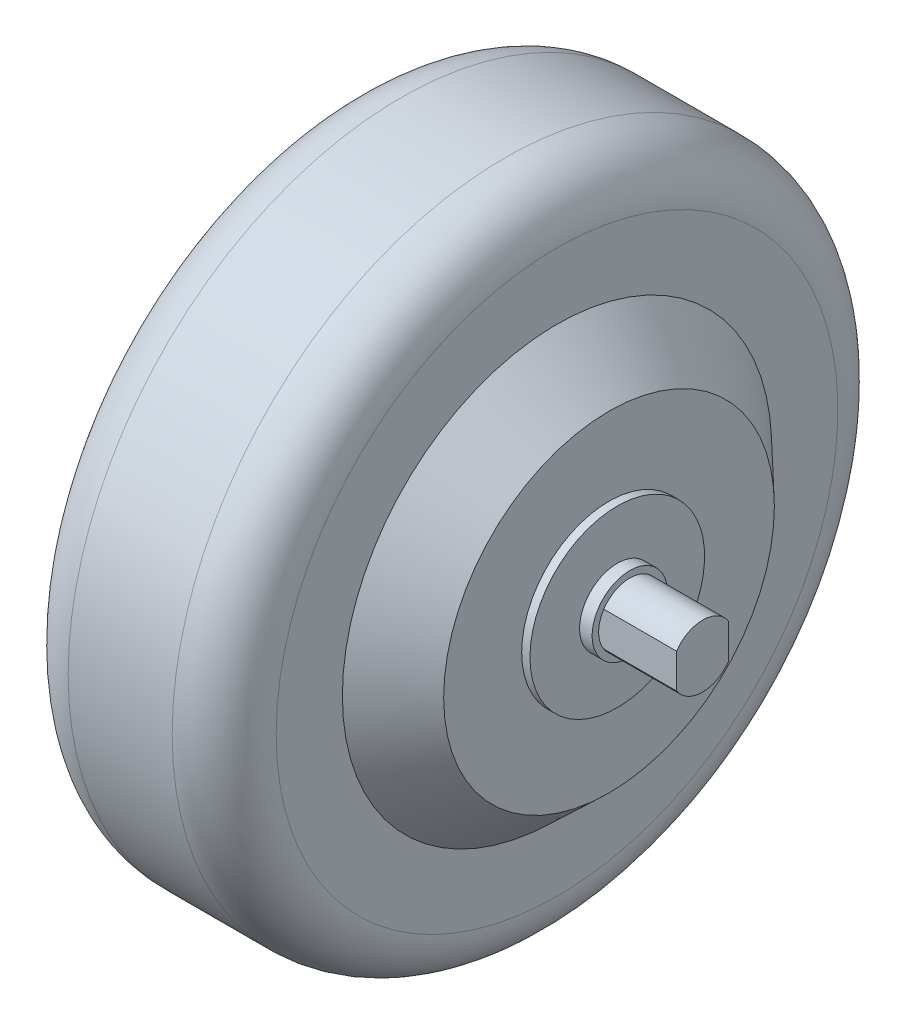
ISO-10303-21;
HEADER;
FILE_DESCRIPTION(('STEP AP214'),'2;1');
FILE_NAME('part.step','',(''),(''),'','','');
FILE_SCHEMA(('AUTOMOTIVE_DESIGN { 1 0 10303 214 1 1 1 1 }'));
ENDSEC;
DATA;
#1=APPLICATION_CONTEXT('core data for automotive mechanical design processes');
#2=APPLICATION_PROTOCOL_DEFINITION('international standard','automotive_design',2000,#1);
#3=PRODUCT_CONTEXT('',#1,'mechanical');
#4=PRODUCT('Part','Part','',(#3));
#5=PRODUCT_RELATED_PRODUCT_CATEGORY('part','',(#4));
#6=PRODUCT_DEFINITION_FORMATION('','',#4);
#7=PRODUCT_DEFINITION_CONTEXT('part definition',#1,'design');
#8=PRODUCT_DEFINITION('design','',#6,#7);
#9=PRODUCT_DEFINITION_SHAPE('','',#8);
#10=(LENGTH_UNIT() NAMED_UNIT(*) SI_UNIT(.MILLI.,.METRE.));
#11=(NAMED_UNIT(*) PLANE_ANGLE_UNIT() SI_UNIT($,.RADIAN.));
#12=(NAMED_UNIT(*) SI_UNIT($,.STERADIAN.) SOLID_ANGLE_UNIT());
#13=UNCERTAINTY_MEASURE_WITH_UNIT(LENGTH_MEASURE(1.E-05),#10,'distance_accuracy_value','');
#14=(GEOMETRIC_REPRESENTATION_CONTEXT(3) GLOBAL_UNCERTAINTY_ASSIGNED_CONTEXT((#13)) GLOBAL_UNIT_ASSIGNED_CONTEXT((#10,
#11,#12)) REPRESENTATION_CONTEXT('',''));
#15=CARTESIAN_POINT('',(0.,0.,0.));
#16=DIRECTION('',(0.,0.,1.));
#17=DIRECTION('',(1.,0.,0.));
#18=AXIS2_PLACEMENT_3D('',#15,#16,#17);
#19=CARTESIAN_POINT('',(-48.,0.,0.));
#20=DIRECTION('',(-1.,0.,0.));
#21=DIRECTION('',(0.,0.,1.));
#22=AXIS2_PLACEMENT_3D('',#19,#20,#21);
#23=CYLINDRICAL_SURFACE('',#22,6.);
#24=DIRECTION('',(1.,0.,0.));
#25=VECTOR('',#24,1.);
#26=CARTESIAN_POINT('',(-40.7082039324994,3.3166247903554,5.));
#27=LINE('',#26,#25);
#28=CARTESIAN_POINT('',(34.,3.3166247903554,5.));
#29=VERTEX_POINT('',#28);
#30=CARTESIAN_POINT('',(48.,3.3166247903554,5.));
#31=VERTEX_POINT('',#30);
#32=EDGE_CURVE('E105',#29,#31,#27,.T.);
#33=ORIENTED_EDGE('',*,*,#32,.T.);
#34=CARTESIAN_POINT('',(48.,0.,0.));
#35=DIRECTION('',(-1.,0.,0.));
#36=DIRECTION('',(0.,0.,1.));
#37=AXIS2_PLACEMENT_3D('',#34,#35,#36);
#38=CIRCLE('',#37,6.);
#39=CARTESIAN_POINT('',(48.,3.3166247903554,-5.));
#40=VERTEX_POINT('',#39);
#41=EDGE_CURVE('E116',#31,#40,#38,.T.);
#42=ORIENTED_EDGE('',*,*,#41,.T.);
#43=DIRECTION('',(1.,0.,0.));
#44=VECTOR('',#43,1.);
#45=CARTESIAN_POINT('',(-40.7082039324994,3.3166247903554,-5.));
#46=LINE('',#45,#44);
#47=CARTESIAN_POINT('',(34.,3.3166247903554,-5.));
#48=VERTEX_POINT('',#47);
#49=EDGE_CURVE('E61',#48,#40,#46,.T.);
#50=ORIENTED_EDGE('',*,*,#49,.F.);
#51=CARTESIAN_POINT('',(34.,0.,0.));
#52=DIRECTION('',(-1.,0.,0.));
#53=DIRECTION('',(0.,0.,1.));
#54=AXIS2_PLACEMENT_3D('',#51,#52,#53);
#55=CIRCLE('',#54,6.);
#56=EDGE_CURVE('E118',#29,#48,#55,.T.);
#57=ORIENTED_EDGE('',*,*,#56,.F.);
#58=EDGE_LOOP('',(#33,#42,#50,#57));
#59=FACE_BOUND('',#58,.T.);
#60=ADVANCED_FACE('F38',(#59),#23,.T.);
#61=DIRECTION('',(1.,0.,0.));
#62=VECTOR('',#61,1.);
#63=CARTESIAN_POINT('',(-40.7082039324994,-3.3166247903554,5.));
#64=LINE('',#63,#62);
#65=CARTESIAN_POINT('',(34.,-3.3166247903554,5.));
#66=VERTEX_POINT('',#65);
#67=CARTESIAN_POINT('',(48.,-3.3166247903554,5.));
#68=VERTEX_POINT('',#67);
#69=EDGE_CURVE('E53',#66,#68,#64,.T.);
#70=ORIENTED_EDGE('',*,*,#69,.F.);
#71=CARTESIAN_POINT('',(34.,-3.3166247903554,-5.));
#72=VERTEX_POINT('',#71);
#73=EDGE_CURVE('E124',#72,#66,#55,.T.);
#74=ORIENTED_EDGE('',*,*,#73,.F.);
#75=DIRECTION('',(1.,0.,0.));
#76=VECTOR('',#75,1.);
#77=CARTESIAN_POINT('',(-40.7082039324994,-3.3166247903554,-5.));
#78=LINE('',#77,#76);
#79=CARTESIAN_POINT('',(48.,-3.3166247903554,-5.));
#80=VERTEX_POINT('',#79);
#81=EDGE_CURVE('E297',#72,#80,#78,.T.);
#82=ORIENTED_EDGE('',*,*,#81,.T.);
#83=EDGE_CURVE('E125',#80,#68,#38,.T.);
#84=ORIENTED_EDGE('',*,*,#83,.T.);
#85=EDGE_LOOP('',(#70,#74,#82,#84));
#86=FACE_BOUND('',#85,.T.);
#87=ADVANCED_FACE('F305',(#86),#23,.T.);
#88=CARTESIAN_POINT('',(48.,6.,0.));
#89=DIRECTION('',(-1.,0.,0.));
#90=DIRECTION('',(0.,0.,1.));
#91=AXIS2_PLACEMENT_3D('',#88,#89,#90);
#92=PLANE('',#91);
#93=DIRECTION('',(0.,-1.,0.));
#94=VECTOR('',#93,1.);
#95=CARTESIAN_POINT('',(48.,3.3166247903554,5.));
#96=LINE('',#95,#94);
#97=EDGE_CURVE('E102',#31,#68,#96,.T.);
#98=ORIENTED_EDGE('',*,*,#97,.T.);
#99=ORIENTED_EDGE('',*,*,#83,.F.);
#100=DIRECTION('',(0.,1.,0.));
#101=VECTOR('',#100,1.);
#102=CARTESIAN_POINT('',(48.,3.3166247903554,-5.));
#103=LINE('',#102,#101);
#104=EDGE_CURVE('E123',#80,#40,#103,.T.);
#105=ORIENTED_EDGE('',*,*,#104,.T.);
#106=ORIENTED_EDGE('',*,*,#41,.F.);
#107=EDGE_LOOP('',(#98,#99,#105,#106));
#108=FACE_BOUND('',#107,.T.);
#109=ADVANCED_FACE('F122',(#108),#92,.F.);
#110=CARTESIAN_POINT('',(-48.,0.,0.));
#111=DIRECTION('',(-1.,0.,0.));
#112=DIRECTION('',(0.,0.,1.));
#113=AXIS2_PLACEMENT_3D('',#110,#111,#112);
#114=CYLINDRICAL_SURFACE('',#113,6.);
#115=CARTESIAN_POINT('',(-34.,0.,0.));
#116=DIRECTION('',(-1.,0.,0.));
#117=DIRECTION('',(0.,0.,1.));
#118=AXIS2_PLACEMENT_3D('',#115,#116,#117);
#119=CIRCLE('',#118,6.);
#120=CARTESIAN_POINT('',(-34.,-3.3166247903554,-5.));
#121=VERTEX_POINT('',#120);
#122=CARTESIAN_POINT('',(-34.,-3.3166247903554,5.));
#123=VERTEX_POINT('',#122);
#124=EDGE_CURVE('E262',#121,#123,#119,.T.);
#125=ORIENTED_EDGE('',*,*,#124,.T.);
#126=DIRECTION('',(-1.,0.,0.));
#127=VECTOR('',#126,1.);
#128=CARTESIAN_POINT('',(-27.2917960675006,-3.3166247903554,5.));
#129=LINE('',#128,#127);
#130=CARTESIAN_POINT('',(-48.,-3.3166247903554,5.));
#131=VERTEX_POINT('',#130);
#132=EDGE_CURVE('E239',#123,#131,#129,.T.);
#133=ORIENTED_EDGE('',*,*,#132,.T.);
#134=CARTESIAN_POINT('',(-48.,0.,0.));
#135=DIRECTION('',(-1.,0.,0.));
#136=DIRECTION('',(0.,0.,1.));
#137=AXIS2_PLACEMENT_3D('',#134,#135,#136);
#138=CIRCLE('',#137,6.);
#139=CARTESIAN_POINT('',(-48.,-3.3166247903554,-5.));
#140=VERTEX_POINT('',#139);
#141=EDGE_CURVE('E265',#140,#131,#138,.T.);
#142=ORIENTED_EDGE('',*,*,#141,.F.);
#143=DIRECTION('',(-1.,0.,0.));
#144=VECTOR('',#143,1.);
#145=CARTESIAN_POINT('',(-27.2917960675006,-3.3166247903554,-5.));
#146=LINE('',#145,#144);
#147=EDGE_CURVE('E240',#121,#140,#146,.T.);
#148=ORIENTED_EDGE('',*,*,#147,.F.);
#149=EDGE_LOOP('',(#125,#133,#142,#148));
#150=FACE_BOUND('',#149,.T.);
#151=ADVANCED_FACE('F274',(#150),#114,.T.);
#152=CARTESIAN_POINT('',(-20.,0.,0.));
#153=DIRECTION('',(1.,0.,0.));
#154=DIRECTION('',(0.,0.,-1.));
#155=AXIS2_PLACEMENT_3D('',#152,#153,#154);
#156=CONICAL_SURFACE('',#155,41.275,0.758710455990273);
#157=CARTESIAN_POINT('',(-30.,0.,0.));
#158=DIRECTION('',(-1.,0.,0.));
#159=DIRECTION('',(0.,0.,1.));
#160=AXIS2_PLACEMENT_3D('',#157,#158,#159);
#161=CIRCLE('',#160,31.795);
#162=CARTESIAN_POINT('',(-30.,0.,31.795));
#163=VERTEX_POINT('',#162);
#164=EDGE_CURVE('E244',#163,#163,#161,.T.);
#165=ORIENTED_EDGE('',*,*,#164,.F.);
#166=EDGE_LOOP('',(#165));
#167=FACE_BOUND('',#166,.T.);
#168=CARTESIAN_POINT('',(-20.,0.,0.));
#169=DIRECTION('',(-1.,0.,0.));
#170=DIRECTION('',(0.,0.,1.));
#171=AXIS2_PLACEMENT_3D('',#168,#169,#170);
#172=CIRCLE('',#171,41.275);
#173=CARTESIAN_POINT('',(-20.,0.,41.275));
#174=VERTEX_POINT('',#173);
#175=EDGE_CURVE('E11',#174,#174,#172,.T.);
#176=ORIENTED_EDGE('',*,*,#175,.T.);
#177=EDGE_LOOP('',(#176));
#178=FACE_BOUND('',#177,.T.);
#179=ADVANCED_FACE('F40',(#167,#178),#156,.T.);
#180=CARTESIAN_POINT('',(-20.,54.,0.));
#181=DIRECTION('',(1.,0.,0.));
#182=DIRECTION('',(0.,0.,-1.));
#183=AXIS2_PLACEMENT_3D('',#180,#181,#182);
#184=PLANE('',#183);
#185=ORIENTED_EDGE('',*,*,#175,.F.);
#186=EDGE_LOOP('',(#185));
#187=FACE_BOUND('',#186,.T.);
#188=CARTESIAN_POINT('',(-20.,0.,0.));
#189=DIRECTION('',(-1.,0.,0.));
#190=DIRECTION('',(0.,0.,1.));
#191=AXIS2_PLACEMENT_3D('',#188,#189,#190);
#192=CIRCLE('',#191,54.);
#193=CARTESIAN_POINT('',(-20.,0.,54.));
#194=VERTEX_POINT('',#193);
#195=EDGE_CURVE('E46',#194,#194,#192,.T.);
#196=ORIENTED_EDGE('',*,*,#195,.T.);
#197=EDGE_LOOP('',(#196));
#198=FACE_BOUND('',#197,.T.);
#199=ADVANCED_FACE('F162',(#187,#198),#184,.F.);
#200=CARTESIAN_POINT('',(-10.,0.,0.));
#201=DIRECTION('',(-1.,0.,0.));
#202=DIRECTION('',(0.,0.,1.));
#203=AXIS2_PLACEMENT_3D('',#200,#201,#202);
#204=TOROIDAL_SURFACE('',#203,54.,9.99999999999999);
#205=ORIENTED_EDGE('',*,*,#195,.F.);
#206=EDGE_LOOP('',(#205));
#207=FACE_BOUND('',#206,.T.);
#208=CARTESIAN_POINT('',(-10.,0.,0.));
#209=DIRECTION('',(-1.,0.,0.));
#210=DIRECTION('',(0.,0.,1.));
#211=AXIS2_PLACEMENT_3D('',#208,#209,#210);
#212=CIRCLE('',#211,64.);
#213=CARTESIAN_POINT('',(-10.,0.,64.));
#214=VERTEX_POINT('',#213);
#215=EDGE_CURVE('E157',#214,#214,#212,.T.);
#216=ORIENTED_EDGE('',*,*,#215,.T.);
#217=EDGE_LOOP('',(#216));
#218=FACE_BOUND('',#217,.T.);
#219=ADVANCED_FACE('F164',(#207,#218),#204,.T.);
#220=CARTESIAN_POINT('',(-48.,0.,0.));
#221=DIRECTION('',(-1.,0.,0.));
#222=DIRECTION('',(0.,0.,1.));
#223=AXIS2_PLACEMENT_3D('',#220,#221,#222);
#224=CYLINDRICAL_SURFACE('',#223,64.);
#225=ORIENTED_EDGE('',*,*,#215,.F.);
#226=EDGE_LOOP('',(#225));
#227=FACE_BOUND('',#226,.T.);
#228=CARTESIAN_POINT('',(10.,0.,0.));
#229=DIRECTION('',(-1.,0.,0.));
#230=DIRECTION('',(0.,0.,1.));
#231=AXIS2_PLACEMENT_3D('',#228,#229,#230);
#232=CIRCLE('',#231,64.);
#233=CARTESIAN_POINT('',(10.,0.,64.));
#234=VERTEX_POINT('',#233);
#235=EDGE_CURVE('E154',#234,#234,#232,.T.);
#236=ORIENTED_EDGE('',*,*,#235,.T.);
#237=EDGE_LOOP('',(#236));
#238=FACE_BOUND('',#237,.T.);
#239=ADVANCED_FACE('F167',(#227,#238),#224,.T.);
#240=CARTESIAN_POINT('',(10.,0.,0.));
#241=DIRECTION('',(-1.,0.,0.));
#242=DIRECTION('',(0.,0.,1.));
#243=AXIS2_PLACEMENT_3D('',#240,#241,#242);
#244=TOROIDAL_SURFACE('',#243,54.,9.99999999999999);
#245=ORIENTED_EDGE('',*,*,#235,.F.);
#246=EDGE_LOOP('',(#245));
#247=FACE_BOUND('',#246,.T.);
#248=CARTESIAN_POINT('',(20.,0.,0.));
#249=DIRECTION('',(-1.,0.,0.));
#250=DIRECTION('',(0.,0.,1.));
#251=AXIS2_PLACEMENT_3D('',#248,#249,#250);
#252=CIRCLE('',#251,54.);
#253=CARTESIAN_POINT('',(20.,0.,54.));
#254=VERTEX_POINT('',#253);
#255=EDGE_CURVE('E151',#254,#254,#252,.T.);
#256=ORIENTED_EDGE('',*,*,#255,.T.);
#257=EDGE_LOOP('',(#256));
#258=FACE_BOUND('',#257,.T.);
#259=ADVANCED_FACE('F173',(#247,#258),#244,.T.);
#260=CARTESIAN_POINT('',(20.,54.,0.));
#261=DIRECTION('',(-1.,0.,0.));
#262=DIRECTION('',(0.,0.,1.));
#263=AXIS2_PLACEMENT_3D('',#260,#261,#262);
#264=PLANE('',#263);
#265=ORIENTED_EDGE('',*,*,#255,.F.);
#266=EDGE_LOOP('',(#265));
#267=FACE_BOUND('',#266,.T.);
#268=CARTESIAN_POINT('',(20.,0.,0.));
#269=DIRECTION('',(-1.,0.,0.));
#270=DIRECTION('',(0.,0.,1.));
#271=AXIS2_PLACEMENT_3D('',#268,#269,#270);
#272=CIRCLE('',#271,41.275);
#273=CARTESIAN_POINT('',(20.,0.,41.275));
#274=VERTEX_POINT('',#273);
#275=EDGE_CURVE('E148',#274,#274,#272,.T.);
#276=ORIENTED_EDGE('',*,*,#275,.T.);
#277=EDGE_LOOP('',(#276));
#278=FACE_BOUND('',#277,.T.);
#279=ADVANCED_FACE('F179',(#267,#278),#264,.F.);
#280=CARTESIAN_POINT('',(30.,0.,0.));
#281=DIRECTION('',(-1.,0.,0.));
#282=DIRECTION('',(0.,0.,1.));
#283=AXIS2_PLACEMENT_3D('',#280,#281,#282);
#284=CONICAL_SURFACE('',#283,31.795,0.758710455990273);
#285=ORIENTED_EDGE('',*,*,#275,.F.);
#286=EDGE_LOOP('',(#285));
#287=FACE_BOUND('',#286,.T.);
#288=CARTESIAN_POINT('',(30.,0.,0.));
#289=DIRECTION('',(-1.,0.,0.));
#290=DIRECTION('',(0.,0.,1.));
#291=AXIS2_PLACEMENT_3D('',#288,#289,#290);
#292=CIRCLE('',#291,31.795);
#293=CARTESIAN_POINT('',(30.,0.,31.795));
#294=VERTEX_POINT('',#293);
#295=EDGE_CURVE('E145',#294,#294,#292,.T.);
#296=ORIENTED_EDGE('',*,*,#295,.T.);
#297=EDGE_LOOP('',(#296));
#298=FACE_BOUND('',#297,.T.);
#299=ADVANCED_FACE('F185',(#287,#298),#284,.T.);
#300=CARTESIAN_POINT('',(30.,31.795,0.));
#301=DIRECTION('',(-1.,0.,0.));
#302=DIRECTION('',(0.,0.,1.));
#303=AXIS2_PLACEMENT_3D('',#300,#301,#302);
#304=PLANE('',#303);
#305=ORIENTED_EDGE('',*,*,#295,.F.);
#306=EDGE_LOOP('',(#305));
#307=FACE_BOUND('',#306,.T.);
#308=CARTESIAN_POINT('',(30.,0.,0.));
#309=DIRECTION('',(-1.,0.,0.));
#310=DIRECTION('',(0.,0.,1.));
#311=AXIS2_PLACEMENT_3D('',#308,#309,#310);
#312=CIRCLE('',#311,16.795);
#313=CARTESIAN_POINT('',(30.,0.,16.795));
#314=VERTEX_POINT('',#313);
#315=EDGE_CURVE('E142',#314,#314,#312,.T.);
#316=ORIENTED_EDGE('',*,*,#315,.T.);
#317=EDGE_LOOP('',(#316));
#318=FACE_BOUND('',#317,.T.);
#319=ADVANCED_FACE('F191',(#307,#318),#304,.F.);
#320=CARTESIAN_POINT('',(-48.,0.,0.));
#321=DIRECTION('',(-1.,0.,0.));
#322=DIRECTION('',(0.,0.,1.));
#323=AXIS2_PLACEMENT_3D('',#320,#321,#322);
#324=CYLINDRICAL_SURFACE('',#323,16.795);
#325=ORIENTED_EDGE('',*,*,#315,.F.);
#326=EDGE_LOOP('',(#325));
#327=FACE_BOUND('',#326,.T.);
#328=CARTESIAN_POINT('',(31.5875,0.,0.));
#329=DIRECTION('',(-1.,0.,0.));
#330=DIRECTION('',(0.,0.,1.));
#331=AXIS2_PLACEMENT_3D('',#328,#329,#330);
#332=CIRCLE('',#331,16.795);
#333=CARTESIAN_POINT('',(31.5875,0.,16.795));
#334=VERTEX_POINT('',#333);
#335=EDGE_CURVE('E139',#334,#334,#332,.T.);
#336=ORIENTED_EDGE('',*,*,#335,.T.);
#337=EDGE_LOOP('',(#336));
#338=FACE_BOUND('',#337,.T.);
#339=ADVANCED_FACE('F197',(#327,#338),#324,.T.);
#340=CARTESIAN_POINT('',(31.5875,16.795,0.));
#341=DIRECTION('',(-1.,0.,0.));
#342=DIRECTION('',(0.,0.,1.));
#343=AXIS2_PLACEMENT_3D('',#340,#341,#342);
#344=PLANE('',#343);
#345=ORIENTED_EDGE('',*,*,#335,.F.);
#346=EDGE_LOOP('',(#345));
#347=FACE_BOUND('',#346,.T.);
#348=CARTESIAN_POINT('',(31.5875,0.,0.));
#349=DIRECTION('',(-1.,0.,0.));
#350=DIRECTION('',(0.,0.,1.));
#351=AXIS2_PLACEMENT_3D('',#348,#349,#350);
#352=CIRCLE('',#351,7.25);
#353=CARTESIAN_POINT('',(31.5875,0.,7.25));
#354=VERTEX_POINT('',#353);
#355=EDGE_CURVE('E136',#354,#354,#352,.T.);
#356=ORIENTED_EDGE('',*,*,#355,.T.);
#357=EDGE_LOOP('',(#356));
#358=FACE_BOUND('',#357,.T.);
#359=ADVANCED_FACE('F203',(#347,#358),#344,.F.);
#360=CARTESIAN_POINT('',(-48.,0.,0.));
#361=DIRECTION('',(-1.,0.,0.));
#362=DIRECTION('',(0.,0.,1.));
#363=AXIS2_PLACEMENT_3D('',#360,#361,#362);
#364=CYLINDRICAL_SURFACE('',#363,7.25);
#365=ORIENTED_EDGE('',*,*,#355,.F.);
#366=EDGE_LOOP('',(#365));
#367=FACE_BOUND('',#366,.T.);
#368=CARTESIAN_POINT('',(34.,0.,0.));
#369=DIRECTION('',(-1.,0.,0.));
#370=DIRECTION('',(0.,0.,1.));
#371=AXIS2_PLACEMENT_3D('',#368,#369,#370);
#372=CIRCLE('',#371,7.25);
#373=CARTESIAN_POINT('',(34.,0.,7.25));
#374=VERTEX_POINT('',#373);
#375=EDGE_CURVE('E133',#374,#374,#372,.T.);
#376=ORIENTED_EDGE('',*,*,#375,.T.);
#377=EDGE_LOOP('',(#376));
#378=FACE_BOUND('',#377,.T.);
#379=ADVANCED_FACE('F209',(#367,#378),#364,.T.);
#380=CARTESIAN_POINT('',(34.,7.25,0.));
#381=DIRECTION('',(-1.,0.,0.));
#382=DIRECTION('',(0.,0.,1.));
#383=AXIS2_PLACEMENT_3D('',#380,#381,#382);
#384=PLANE('',#383);
#385=ORIENTED_EDGE('',*,*,#375,.F.);
#386=EDGE_LOOP('',(#385));
#387=FACE_BOUND('',#386,.T.);
#388=ORIENTED_EDGE('',*,*,#56,.T.);
#389=CARTESIAN_POINT('',(34.,0.,0.));
#390=DIRECTION('',(-1.,0.,0.));
#391=DIRECTION('',(0.,0.,1.));
#392=AXIS2_PLACEMENT_3D('',#389,#390,#391);
#393=CIRCLE('',#392,6.);
#394=EDGE_CURVE('E225',#72,#48,#393,.F.);
#395=ORIENTED_EDGE('',*,*,#394,.F.);
#396=ORIENTED_EDGE('',*,*,#73,.T.);
#397=CARTESIAN_POINT('',(34.,0.,0.));
#398=DIRECTION('',(-1.,0.,0.));
#399=DIRECTION('',(0.,0.,1.));
#400=AXIS2_PLACEMENT_3D('',#397,#398,#399);
#401=CIRCLE('',#400,6.);
#402=EDGE_CURVE('E226',#29,#66,#401,.F.);
#403=ORIENTED_EDGE('',*,*,#402,.F.);
#404=EDGE_LOOP('',(#388,#395,#396,#403));
#405=FACE_BOUND('',#404,.T.);
#406=ADVANCED_FACE('F215',(#387,#405),#384,.F.);
#407=CARTESIAN_POINT('',(-48.,6.,0.));
#408=DIRECTION('',(1.,0.,0.));
#409=DIRECTION('',(0.,0.,-1.));
#410=AXIS2_PLACEMENT_3D('',#407,#408,#409);
#411=PLANE('',#410);
#412=ORIENTED_EDGE('',*,*,#141,.T.);
#413=DIRECTION('',(0.,-1.,0.));
#414=VECTOR('',#413,1.);
#415=CARTESIAN_POINT('',(-48.,3.3166247903554,5.));
#416=LINE('',#415,#414);
#417=CARTESIAN_POINT('',(-48.,3.3166247903554,5.));
#418=VERTEX_POINT('',#417);
#419=EDGE_CURVE('E237',#418,#131,#416,.T.);
#420=ORIENTED_EDGE('',*,*,#419,.F.);
#421=CARTESIAN_POINT('',(-48.,3.3166247903554,-5.));
#422=VERTEX_POINT('',#421);
#423=EDGE_CURVE('E129',#418,#422,#138,.T.);
#424=ORIENTED_EDGE('',*,*,#423,.T.);
#425=DIRECTION('',(0.,1.,0.));
#426=VECTOR('',#425,1.);
#427=CARTESIAN_POINT('',(-48.,3.3166247903554,-5.));
#428=LINE('',#427,#426);
#429=EDGE_CURVE('E229',#140,#422,#428,.T.);
#430=ORIENTED_EDGE('',*,*,#429,.F.);
#431=EDGE_LOOP('',(#412,#420,#424,#430));
#432=FACE_BOUND('',#431,.T.);
#433=ADVANCED_FACE('F221',(#432),#411,.F.);
#434=ORIENTED_EDGE('',*,*,#423,.F.);
#435=DIRECTION('',(-1.,0.,0.));
#436=VECTOR('',#435,1.);
#437=CARTESIAN_POINT('',(-27.2917960675006,3.3166247903554,5.));
#438=LINE('',#437,#436);
#439=CARTESIAN_POINT('',(-34.,3.3166247903554,5.));
#440=VERTEX_POINT('',#439);
#441=EDGE_CURVE('E243',#440,#418,#438,.T.);
#442=ORIENTED_EDGE('',*,*,#441,.F.);
#443=CARTESIAN_POINT('',(-34.,3.3166247903554,-5.));
#444=VERTEX_POINT('',#443);
#445=EDGE_CURVE('E263',#440,#444,#119,.T.);
#446=ORIENTED_EDGE('',*,*,#445,.T.);
#447=DIRECTION('',(-1.,0.,0.));
#448=VECTOR('',#447,1.);
#449=CARTESIAN_POINT('',(-27.2917960675006,3.3166247903554,-5.));
#450=LINE('',#449,#448);
#451=EDGE_CURVE('E231',#444,#422,#450,.T.);
#452=ORIENTED_EDGE('',*,*,#451,.T.);
#453=EDGE_LOOP('',(#434,#442,#446,#452));
#454=FACE_BOUND('',#453,.T.);
#455=ADVANCED_FACE('F291',(#454),#114,.T.);
#456=CARTESIAN_POINT('',(-34.,6.,0.));
#457=DIRECTION('',(1.,0.,0.));
#458=DIRECTION('',(0.,0.,-1.));
#459=AXIS2_PLACEMENT_3D('',#456,#457,#458);
#460=PLANE('',#459);
#461=CARTESIAN_POINT('',(-34.,0.,0.));
#462=DIRECTION('',(1.,0.,0.));
#463=DIRECTION('',(0.,0.,-1.));
#464=AXIS2_PLACEMENT_3D('',#461,#462,#463);
#465=CIRCLE('',#464,6.);
#466=EDGE_CURVE('E233',#440,#123,#465,.T.);
#467=ORIENTED_EDGE('',*,*,#466,.T.);
#468=ORIENTED_EDGE('',*,*,#124,.F.);
#469=CARTESIAN_POINT('',(-34.,0.,0.));
#470=DIRECTION('',(1.,0.,0.));
#471=DIRECTION('',(0.,0.,-1.));
#472=AXIS2_PLACEMENT_3D('',#469,#470,#471);
#473=CIRCLE('',#472,6.);
#474=EDGE_CURVE('E111',#121,#444,#473,.T.);
#475=ORIENTED_EDGE('',*,*,#474,.T.);
#476=ORIENTED_EDGE('',*,*,#445,.F.);
#477=EDGE_LOOP('',(#467,#468,#475,#476));
#478=FACE_BOUND('',#477,.T.);
#479=CARTESIAN_POINT('',(-34.,0.,0.));
#480=DIRECTION('',(-1.,0.,0.));
#481=DIRECTION('',(0.,0.,1.));
#482=AXIS2_PLACEMENT_3D('',#479,#480,#481);
#483=CIRCLE('',#482,7.25);
#484=CARTESIAN_POINT('',(-34.,0.,7.25));
#485=VERTEX_POINT('',#484);
#486=EDGE_CURVE('E260',#485,#485,#483,.T.);
#487=ORIENTED_EDGE('',*,*,#486,.T.);
#488=EDGE_LOOP('',(#487));
#489=FACE_BOUND('',#488,.T.);
#490=ADVANCED_FACE('F280',(#478,#489),#460,.F.);
#491=CARTESIAN_POINT('',(-48.,0.,0.));
#492=DIRECTION('',(-1.,0.,0.));
#493=DIRECTION('',(0.,0.,1.));
#494=AXIS2_PLACEMENT_3D('',#491,#492,#493);
#495=CYLINDRICAL_SURFACE('',#494,7.25);
#496=ORIENTED_EDGE('',*,*,#486,.F.);
#497=EDGE_LOOP('',(#496));
#498=FACE_BOUND('',#497,.T.);
#499=CARTESIAN_POINT('',(-31.5875,0.,0.));
#500=DIRECTION('',(-1.,0.,0.));
#501=DIRECTION('',(0.,0.,1.));
#502=AXIS2_PLACEMENT_3D('',#499,#500,#501);
#503=CIRCLE('',#502,7.25);
#504=CARTESIAN_POINT('',(-31.5875,0.,7.25));
#505=VERTEX_POINT('',#504);
#506=EDGE_CURVE('E257',#505,#505,#503,.T.);
#507=ORIENTED_EDGE('',*,*,#506,.T.);
#508=EDGE_LOOP('',(#507));
#509=FACE_BOUND('',#508,.T.);
#510=ADVANCED_FACE('F346',(#498,#509),#495,.T.);
#511=CARTESIAN_POINT('',(-31.5875,16.795,0.));
#512=DIRECTION('',(1.,0.,0.));
#513=DIRECTION('',(0.,0.,-1.));
#514=AXIS2_PLACEMENT_3D('',#511,#512,#513);
#515=PLANE('',#514);
#516=ORIENTED_EDGE('',*,*,#506,.F.);
#517=EDGE_LOOP('',(#516));
#518=FACE_BOUND('',#517,.T.);
#519=CARTESIAN_POINT('',(-31.5875,0.,0.));
#520=DIRECTION('',(-1.,0.,0.));
#521=DIRECTION('',(0.,0.,1.));
#522=AXIS2_PLACEMENT_3D('',#519,#520,#521);
#523=CIRCLE('',#522,16.795);
#524=CARTESIAN_POINT('',(-31.5875,0.,16.795));
#525=VERTEX_POINT('',#524);
#526=EDGE_CURVE('E254',#525,#525,#523,.T.);
#527=ORIENTED_EDGE('',*,*,#526,.T.);
#528=EDGE_LOOP('',(#527));
#529=FACE_BOUND('',#528,.T.);
#530=ADVANCED_FACE('F338',(#518,#529),#515,.F.);
#531=CARTESIAN_POINT('',(-48.,0.,0.));
#532=DIRECTION('',(-1.,0.,0.));
#533=DIRECTION('',(0.,0.,1.));
#534=AXIS2_PLACEMENT_3D('',#531,#532,#533);
#535=CYLINDRICAL_SURFACE('',#534,16.795);
#536=ORIENTED_EDGE('',*,*,#526,.F.);
#537=EDGE_LOOP('',(#536));
#538=FACE_BOUND('',#537,.T.);
#539=CARTESIAN_POINT('',(-30.,0.,0.));
#540=DIRECTION('',(-1.,0.,0.));
#541=DIRECTION('',(0.,0.,1.));
#542=AXIS2_PLACEMENT_3D('',#539,#540,#541);
#543=CIRCLE('',#542,16.795);
#544=CARTESIAN_POINT('',(-30.,0.,16.795));
#545=VERTEX_POINT('',#544);
#546=EDGE_CURVE('E251',#545,#545,#543,.T.);
#547=ORIENTED_EDGE('',*,*,#546,.T.);
#548=EDGE_LOOP('',(#547));
#549=FACE_BOUND('',#548,.T.);
#550=ADVANCED_FACE('F330',(#538,#549),#535,.T.);
#551=CARTESIAN_POINT('',(-30.,31.795,0.));
#552=DIRECTION('',(1.,0.,0.));
#553=DIRECTION('',(0.,0.,-1.));
#554=AXIS2_PLACEMENT_3D('',#551,#552,#553);
#555=PLANE('',#554);
#556=ORIENTED_EDGE('',*,*,#546,.F.);
#557=EDGE_LOOP('',(#556));
#558=FACE_BOUND('',#557,.T.);
#559=ORIENTED_EDGE('',*,*,#164,.T.);
#560=EDGE_LOOP('',(#559));
#561=FACE_BOUND('',#560,.T.);
#562=ADVANCED_FACE('F328',(#558,#561),#555,.F.);
#563=CARTESIAN_POINT('',(-27.2917960675006,3.3166247903554,-5.));
#564=DIRECTION('',(0.,0.,1.));
#565=DIRECTION('',(1.,0.,0.));
#566=AXIS2_PLACEMENT_3D('',#563,#564,#565);
#567=PLANE('',#566);
#568=ORIENTED_EDGE('',*,*,#147,.T.);
#569=ORIENTED_EDGE('',*,*,#429,.T.);
#570=ORIENTED_EDGE('',*,*,#451,.F.);
#571=EDGE_CURVE('E293',#444,#48,#46,.T.);
#572=ORIENTED_EDGE('',*,*,#571,.T.);
#573=ORIENTED_EDGE('',*,*,#49,.T.);
#574=ORIENTED_EDGE('',*,*,#104,.F.);
#575=ORIENTED_EDGE('',*,*,#81,.F.);
#576=EDGE_CURVE('E295',#121,#72,#78,.T.);
#577=ORIENTED_EDGE('',*,*,#576,.F.);
#578=EDGE_LOOP('',(#568,#569,#570,#572,#573,#574,#575,#577));
#579=FACE_BOUND('',#578,.T.);
#580=ADVANCED_FACE('F292',(#579),#567,.F.);
#581=CARTESIAN_POINT('',(-27.2917960675006,3.3166247903554,5.));
#582=DIRECTION('',(0.,0.,-1.));
#583=DIRECTION('',(-1.,0.,0.));
#584=AXIS2_PLACEMENT_3D('',#581,#582,#583);
#585=PLANE('',#584);
#586=ORIENTED_EDGE('',*,*,#441,.T.);
#587=ORIENTED_EDGE('',*,*,#419,.T.);
#588=ORIENTED_EDGE('',*,*,#132,.F.);
#589=EDGE_CURVE('E120',#123,#66,#64,.T.);
#590=ORIENTED_EDGE('',*,*,#589,.T.);
#591=ORIENTED_EDGE('',*,*,#69,.T.);
#592=ORIENTED_EDGE('',*,*,#97,.F.);
#593=ORIENTED_EDGE('',*,*,#32,.F.);
#594=EDGE_CURVE('E119',#440,#29,#27,.T.);
#595=ORIENTED_EDGE('',*,*,#594,.F.);
#596=EDGE_LOOP('',(#586,#587,#588,#590,#591,#592,#593,#595));
#597=FACE_BOUND('',#596,.T.);
#598=ADVANCED_FACE('F104',(#597),#585,.F.);
#599=CARTESIAN_POINT('',(-40.7082039324994,0.,0.));
#600=DIRECTION('',(1.,0.,0.));
#601=DIRECTION('',(0.,0.,-1.));
#602=AXIS2_PLACEMENT_3D('',#599,#600,#601);
#603=CYLINDRICAL_SURFACE('',#602,6.);
#604=ORIENTED_EDGE('',*,*,#402,.T.);
#605=ORIENTED_EDGE('',*,*,#589,.F.);
#606=ORIENTED_EDGE('',*,*,#466,.F.);
#607=ORIENTED_EDGE('',*,*,#594,.T.);
#608=EDGE_LOOP('',(#604,#605,#606,#607));
#609=FACE_BOUND('',#608,.T.);
#610=ADVANCED_FACE('F537',(#609),#603,.F.);
#611=CARTESIAN_POINT('',(-40.7082039324994,0.,0.));
#612=DIRECTION('',(1.,0.,0.));
#613=DIRECTION('',(0.,0.,-1.));
#614=AXIS2_PLACEMENT_3D('',#611,#612,#613);
#615=CYLINDRICAL_SURFACE('',#614,6.);
#616=ORIENTED_EDGE('',*,*,#394,.T.);
#617=ORIENTED_EDGE('',*,*,#571,.F.);
#618=ORIENTED_EDGE('',*,*,#474,.F.);
#619=ORIENTED_EDGE('',*,*,#576,.T.);
#620=EDGE_LOOP('',(#616,#617,#618,#619));
#621=FACE_BOUND('',#620,.T.);
#622=ADVANCED_FACE('F300',(#621),#615,.F.);
#623=CLOSED_SHELL('',(#60,#87,#109,#151,#179,#199,#219,#239,#259,#279,#299,#319,#339,#359,#379,
#406,#433,#455,#490,#510,#530,#550,#562,#580,#598,#610,#622));
#624=MANIFOLD_SOLID_BREP('B2',#623);
#625=ADVANCED_BREP_SHAPE_REPRESENTATION('',(#18,#624),#14);
#626=SHAPE_DEFINITION_REPRESENTATION(#9,#625);
ENDSEC;
END-ISO-10303-21;
